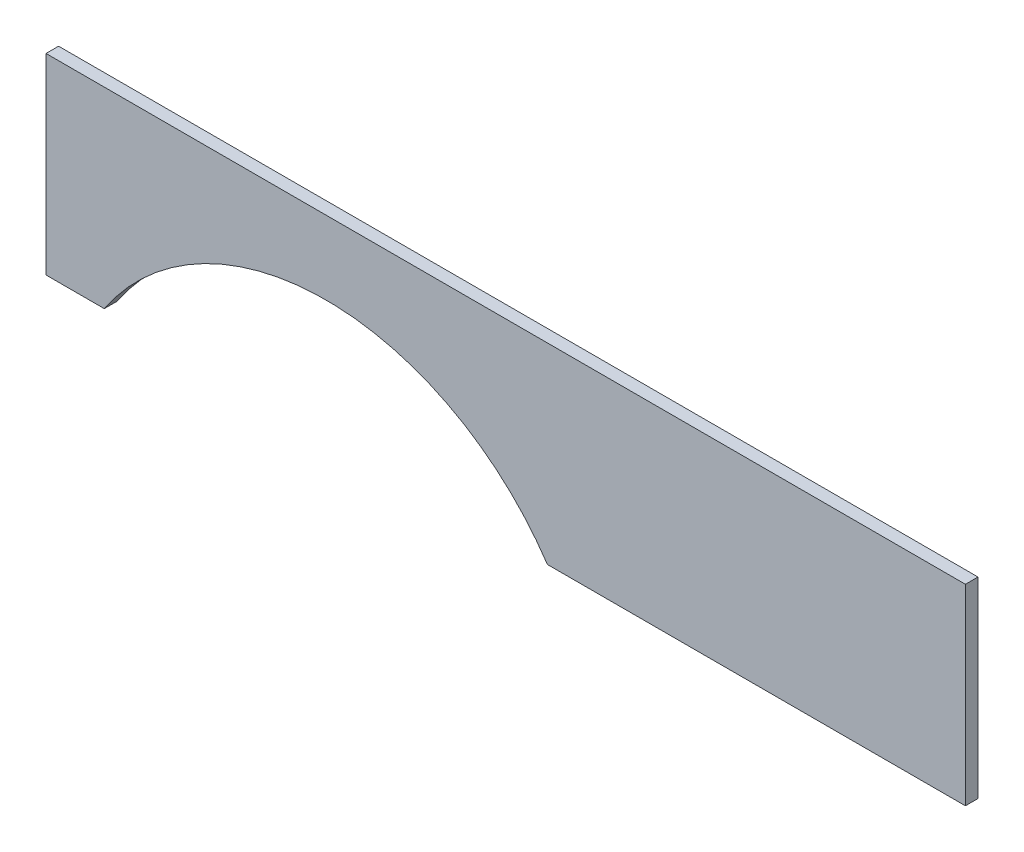
ISO-10303-21;
HEADER;
FILE_DESCRIPTION(('STEP AP214'),'2;1');
FILE_NAME('part.step','',(''),(''),'','','');
FILE_SCHEMA(('AUTOMOTIVE_DESIGN { 1 0 10303 214 1 1 1 1 }'));
ENDSEC;
DATA;
#1=APPLICATION_CONTEXT('core data for automotive mechanical design processes');
#2=APPLICATION_PROTOCOL_DEFINITION('international standard','automotive_design',2000,#1);
#3=PRODUCT_CONTEXT('',#1,'mechanical');
#4=PRODUCT('Part','Part','',(#3));
#5=PRODUCT_RELATED_PRODUCT_CATEGORY('part','',(#4));
#6=PRODUCT_DEFINITION_FORMATION('','',#4);
#7=PRODUCT_DEFINITION_CONTEXT('part definition',#1,'design');
#8=PRODUCT_DEFINITION('design','',#6,#7);
#9=PRODUCT_DEFINITION_SHAPE('','',#8);
#10=(LENGTH_UNIT() NAMED_UNIT(*) SI_UNIT(.MILLI.,.METRE.));
#11=(NAMED_UNIT(*) PLANE_ANGLE_UNIT() SI_UNIT($,.RADIAN.));
#12=(NAMED_UNIT(*) SI_UNIT($,.STERADIAN.) SOLID_ANGLE_UNIT());
#13=UNCERTAINTY_MEASURE_WITH_UNIT(LENGTH_MEASURE(1.E-05),#10,'distance_accuracy_value','');
#14=(GEOMETRIC_REPRESENTATION_CONTEXT(3) GLOBAL_UNCERTAINTY_ASSIGNED_CONTEXT((#13)) GLOBAL_UNIT_ASSIGNED_CONTEXT((#10,
#11,#12)) REPRESENTATION_CONTEXT('',''));
#15=CARTESIAN_POINT('',(0.,0.,0.));
#16=DIRECTION('',(0.,0.,1.));
#17=DIRECTION('',(1.,0.,0.));
#18=AXIS2_PLACEMENT_3D('',#15,#16,#17);
#19=CARTESIAN_POINT('',(0.,0.,3.));
#20=DIRECTION('',(0.,1.,0.));
#21=DIRECTION('',(0.,0.,1.));
#22=AXIS2_PLACEMENT_3D('',#19,#20,#21);
#23=PLANE('',#22);
#24=DIRECTION('',(1.,0.,0.));
#25=VECTOR('',#24,1.);
#26=CARTESIAN_POINT('',(0.,0.,0.));
#27=LINE('',#26,#25);
#28=CARTESIAN_POINT('',(0.,0.,0.));
#29=VERTEX_POINT('',#28);
#30=CARTESIAN_POINT('',(13.8892252377369,0.,0.));
#31=VERTEX_POINT('',#30);
#32=EDGE_CURVE('E123',#29,#31,#27,.T.);
#33=ORIENTED_EDGE('',*,*,#32,.T.);
#34=DIRECTION('',(0.,0.,1.));
#35=VECTOR('',#34,1.);
#36=CARTESIAN_POINT('',(13.8892252377369,0.,0.));
#37=LINE('',#36,#35);
#38=CARTESIAN_POINT('',(13.8892252377369,0.,3.));
#39=VERTEX_POINT('',#38);
#40=EDGE_CURVE('E55',#31,#39,#37,.T.);
#41=ORIENTED_EDGE('',*,*,#40,.T.);
#42=DIRECTION('',(1.,0.,0.));
#43=VECTOR('',#42,1.);
#44=CARTESIAN_POINT('',(0.,0.,3.));
#45=LINE('',#44,#43);
#46=CARTESIAN_POINT('',(0.,0.,3.));
#47=VERTEX_POINT('',#46);
#48=EDGE_CURVE('E91',#47,#39,#45,.T.);
#49=ORIENTED_EDGE('',*,*,#48,.F.);
#50=DIRECTION('',(0.,0.,-1.));
#51=VECTOR('',#50,1.);
#52=CARTESIAN_POINT('',(0.,0.,3.));
#53=LINE('',#52,#51);
#54=EDGE_CURVE('E11',#47,#29,#53,.T.);
#55=ORIENTED_EDGE('',*,*,#54,.T.);
#56=EDGE_LOOP('',(#33,#41,#49,#55));
#57=FACE_BOUND('',#56,.T.);
#58=ADVANCED_FACE('F39',(#57),#23,.F.);
#59=CARTESIAN_POINT('',(0.,0.,3.));
#60=DIRECTION('',(1.,0.,0.));
#61=DIRECTION('',(0.,0.,-1.));
#62=AXIS2_PLACEMENT_3D('',#59,#60,#61);
#63=PLANE('',#62);
#64=DIRECTION('',(0.,-1.,0.));
#65=VECTOR('',#64,1.);
#66=CARTESIAN_POINT('',(0.,0.,0.));
#67=LINE('',#66,#65);
#68=CARTESIAN_POINT('',(0.,45.72,0.));
#69=VERTEX_POINT('',#68);
#70=EDGE_CURVE('E124',#69,#29,#67,.T.);
#71=ORIENTED_EDGE('',*,*,#70,.T.);
#72=ORIENTED_EDGE('',*,*,#54,.F.);
#73=DIRECTION('',(0.,-1.,0.));
#74=VECTOR('',#73,1.);
#75=CARTESIAN_POINT('',(0.,0.,3.));
#76=LINE('',#75,#74);
#77=CARTESIAN_POINT('',(0.,45.72,3.));
#78=VERTEX_POINT('',#77);
#79=EDGE_CURVE('E136',#78,#47,#76,.T.);
#80=ORIENTED_EDGE('',*,*,#79,.F.);
#81=DIRECTION('',(0.,0.,-1.));
#82=VECTOR('',#81,1.);
#83=CARTESIAN_POINT('',(0.,45.72,3.));
#84=LINE('',#83,#82);
#85=EDGE_CURVE('E137',#78,#69,#84,.T.);
#86=ORIENTED_EDGE('',*,*,#85,.T.);
#87=EDGE_LOOP('',(#71,#72,#80,#86));
#88=FACE_BOUND('',#87,.T.);
#89=ADVANCED_FACE('F41',(#88),#63,.F.);
#90=CARTESIAN_POINT('',(119.470774762263,0.,3.));
#91=VERTEX_POINT('',#90);
#92=CARTESIAN_POINT('',(219.075,0.,3.));
#93=VERTEX_POINT('',#92);
#94=EDGE_CURVE('E116',#91,#93,#45,.T.);
#95=ORIENTED_EDGE('',*,*,#94,.F.);
#96=DIRECTION('',(0.,0.,1.));
#97=VECTOR('',#96,1.);
#98=CARTESIAN_POINT('',(119.470774762263,0.,0.));
#99=LINE('',#98,#97);
#100=CARTESIAN_POINT('',(119.470774762263,0.,0.));
#101=VERTEX_POINT('',#100);
#102=EDGE_CURVE('E102',#91,#101,#99,.F.);
#103=ORIENTED_EDGE('',*,*,#102,.T.);
#104=CARTESIAN_POINT('',(219.075,0.,0.));
#105=VERTEX_POINT('',#104);
#106=EDGE_CURVE('E114',#101,#105,#27,.T.);
#107=ORIENTED_EDGE('',*,*,#106,.T.);
#108=DIRECTION('',(0.,0.,-1.));
#109=VECTOR('',#108,1.);
#110=CARTESIAN_POINT('',(219.075,0.,3.));
#111=LINE('',#110,#109);
#112=EDGE_CURVE('E48',#93,#105,#111,.T.);
#113=ORIENTED_EDGE('',*,*,#112,.F.);
#114=EDGE_LOOP('',(#95,#103,#107,#113));
#115=FACE_BOUND('',#114,.T.);
#116=ADVANCED_FACE('F112',(#115),#23,.F.);
#117=CARTESIAN_POINT('',(219.075,0.,3.));
#118=DIRECTION('',(-1.,0.,0.));
#119=DIRECTION('',(0.,0.,1.));
#120=AXIS2_PLACEMENT_3D('',#117,#118,#119);
#121=PLANE('',#120);
#122=DIRECTION('',(0.,1.,0.));
#123=VECTOR('',#122,1.);
#124=CARTESIAN_POINT('',(219.075,0.,0.));
#125=LINE('',#124,#123);
#126=CARTESIAN_POINT('',(219.075,45.72,0.));
#127=VERTEX_POINT('',#126);
#128=EDGE_CURVE('E121',#105,#127,#125,.T.);
#129=ORIENTED_EDGE('',*,*,#128,.T.);
#130=DIRECTION('',(0.,0.,-1.));
#131=VECTOR('',#130,1.);
#132=CARTESIAN_POINT('',(219.075,45.72,3.));
#133=LINE('',#132,#131);
#134=CARTESIAN_POINT('',(219.075,45.72,3.));
#135=VERTEX_POINT('',#134);
#136=EDGE_CURVE('E140',#135,#127,#133,.T.);
#137=ORIENTED_EDGE('',*,*,#136,.F.);
#138=DIRECTION('',(0.,1.,0.));
#139=VECTOR('',#138,1.);
#140=CARTESIAN_POINT('',(219.075,0.,3.));
#141=LINE('',#140,#139);
#142=EDGE_CURVE('E147',#93,#135,#141,.T.);
#143=ORIENTED_EDGE('',*,*,#142,.F.);
#144=ORIENTED_EDGE('',*,*,#112,.T.);
#145=EDGE_LOOP('',(#129,#137,#143,#144));
#146=FACE_BOUND('',#145,.T.);
#147=ADVANCED_FACE('F145',(#146),#121,.F.);
#148=CARTESIAN_POINT('',(0.,45.72,3.));
#149=DIRECTION('',(0.,-1.,0.));
#150=DIRECTION('',(0.,0.,-1.));
#151=AXIS2_PLACEMENT_3D('',#148,#149,#150);
#152=PLANE('',#151);
#153=DIRECTION('',(-1.,0.,0.));
#154=VECTOR('',#153,1.);
#155=CARTESIAN_POINT('',(0.,45.72,0.));
#156=LINE('',#155,#154);
#157=EDGE_CURVE('E85',#127,#69,#156,.T.);
#158=ORIENTED_EDGE('',*,*,#157,.T.);
#159=ORIENTED_EDGE('',*,*,#85,.F.);
#160=DIRECTION('',(-1.,0.,0.));
#161=VECTOR('',#160,1.);
#162=CARTESIAN_POINT('',(0.,45.72,3.));
#163=LINE('',#162,#161);
#164=EDGE_CURVE('E64',#135,#78,#163,.T.);
#165=ORIENTED_EDGE('',*,*,#164,.F.);
#166=ORIENTED_EDGE('',*,*,#136,.T.);
#167=EDGE_LOOP('',(#158,#159,#165,#166));
#168=FACE_BOUND('',#167,.T.);
#169=ADVANCED_FACE('F164',(#168),#152,.F.);
#170=CARTESIAN_POINT('',(0.,0.,3.));
#171=DIRECTION('',(0.,0.,-1.));
#172=DIRECTION('',(-1.,0.,0.));
#173=AXIS2_PLACEMENT_3D('',#170,#171,#172);
#174=PLANE('',#173);
#175=ORIENTED_EDGE('',*,*,#48,.T.);
#176=CARTESIAN_POINT('',(66.68,-35.29,3.));
#177=DIRECTION('',(0.,0.,-1.));
#178=DIRECTION('',(-1.,0.,0.));
#179=AXIS2_PLACEMENT_3D('',#176,#177,#178);
#180=CIRCLE('',#179,63.5);
#181=EDGE_CURVE('E108',#39,#91,#180,.T.);
#182=ORIENTED_EDGE('',*,*,#181,.T.);
#183=ORIENTED_EDGE('',*,*,#94,.T.);
#184=ORIENTED_EDGE('',*,*,#142,.T.);
#185=ORIENTED_EDGE('',*,*,#164,.T.);
#186=ORIENTED_EDGE('',*,*,#79,.T.);
#187=EDGE_LOOP('',(#175,#182,#183,#184,#185,#186));
#188=FACE_BOUND('',#187,.T.);
#189=ADVANCED_FACE('F159',(#188),#174,.F.);
#190=CARTESIAN_POINT('',(0.,0.,0.));
#191=DIRECTION('',(0.,0.,-1.));
#192=DIRECTION('',(-1.,0.,0.));
#193=AXIS2_PLACEMENT_3D('',#190,#191,#192);
#194=PLANE('',#193);
#195=CARTESIAN_POINT('',(66.68,-35.29,0.));
#196=DIRECTION('',(0.,0.,1.));
#197=DIRECTION('',(1.,0.,0.));
#198=AXIS2_PLACEMENT_3D('',#195,#196,#197);
#199=CIRCLE('',#198,63.5);
#200=EDGE_CURVE('E99',#101,#31,#199,.T.);
#201=ORIENTED_EDGE('',*,*,#200,.T.);
#202=ORIENTED_EDGE('',*,*,#32,.F.);
#203=ORIENTED_EDGE('',*,*,#70,.F.);
#204=ORIENTED_EDGE('',*,*,#157,.F.);
#205=ORIENTED_EDGE('',*,*,#128,.F.);
#206=ORIENTED_EDGE('',*,*,#106,.F.);
#207=EDGE_LOOP('',(#201,#202,#203,#204,#205,#206));
#208=FACE_BOUND('',#207,.T.);
#209=ADVANCED_FACE('F120',(#208),#194,.T.);
#210=CARTESIAN_POINT('',(66.68,-35.29,0.));
#211=DIRECTION('',(0.,0.,1.));
#212=DIRECTION('',(1.,0.,0.));
#213=AXIS2_PLACEMENT_3D('',#210,#211,#212);
#214=CYLINDRICAL_SURFACE('',#213,63.5);
#215=ORIENTED_EDGE('',*,*,#200,.F.);
#216=ORIENTED_EDGE('',*,*,#102,.F.);
#217=ORIENTED_EDGE('',*,*,#181,.F.);
#218=ORIENTED_EDGE('',*,*,#40,.F.);
#219=EDGE_LOOP('',(#215,#216,#217,#218));
#220=FACE_BOUND('',#219,.T.);
#221=ADVANCED_FACE('F101',(#220),#214,.F.);
#222=CLOSED_SHELL('',(#58,#89,#116,#147,#169,#189,#209,#221));
#223=MANIFOLD_SOLID_BREP('B2',#222);
#224=ADVANCED_BREP_SHAPE_REPRESENTATION('',(#18,#223),#14);
#225=SHAPE_DEFINITION_REPRESENTATION(#9,#224);
ENDSEC;
END-ISO-10303-21;
